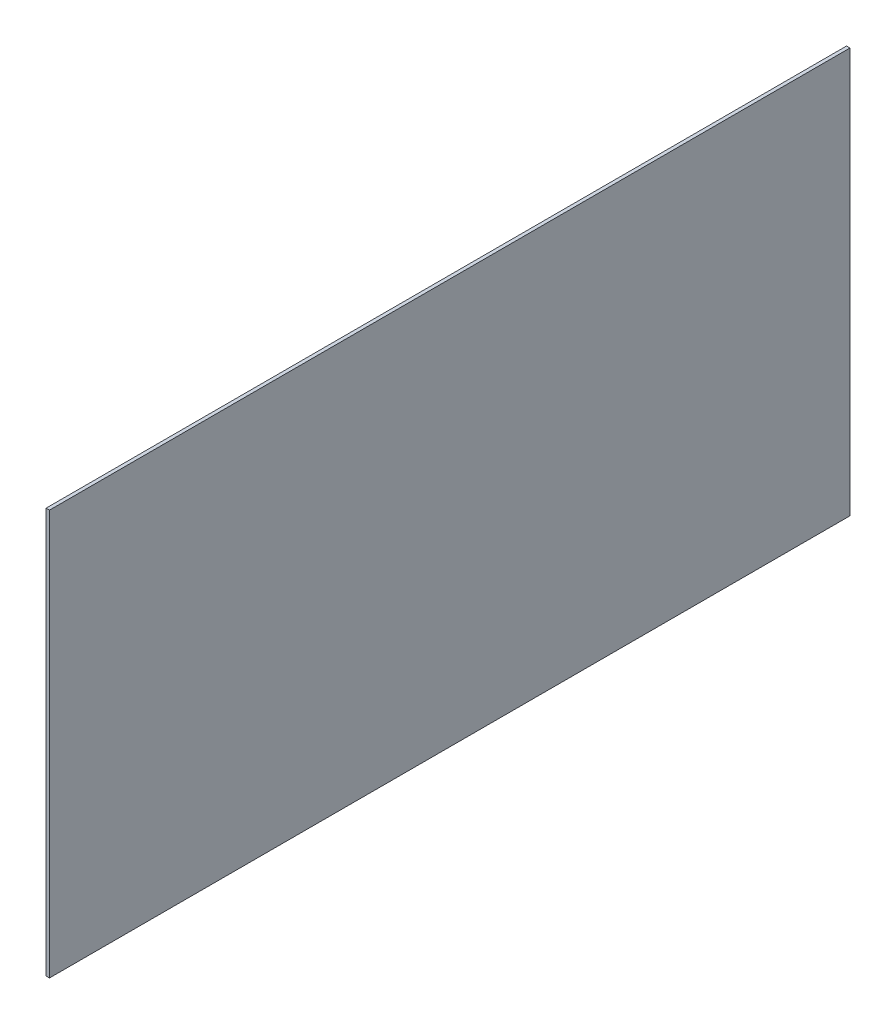
ISO-10303-21;
HEADER;
FILE_DESCRIPTION(('STEP AP214'),'2;1');
FILE_NAME('part.step','',(''),(''),'','','');
FILE_SCHEMA(('AUTOMOTIVE_DESIGN { 1 0 10303 214 1 1 1 1 }'));
ENDSEC;
DATA;
#1=APPLICATION_CONTEXT('core data for automotive mechanical design processes');
#2=APPLICATION_PROTOCOL_DEFINITION('international standard','automotive_design',2000,#1);
#3=PRODUCT_CONTEXT('',#1,'mechanical');
#4=PRODUCT('Part','Part','',(#3));
#5=PRODUCT_RELATED_PRODUCT_CATEGORY('part','',(#4));
#6=PRODUCT_DEFINITION_FORMATION('','',#4);
#7=PRODUCT_DEFINITION_CONTEXT('part definition',#1,'design');
#8=PRODUCT_DEFINITION('design','',#6,#7);
#9=PRODUCT_DEFINITION_SHAPE('','',#8);
#10=(LENGTH_UNIT() NAMED_UNIT(*) SI_UNIT(.MILLI.,.METRE.));
#11=(NAMED_UNIT(*) PLANE_ANGLE_UNIT() SI_UNIT($,.RADIAN.));
#12=(NAMED_UNIT(*) SI_UNIT($,.STERADIAN.) SOLID_ANGLE_UNIT());
#13=UNCERTAINTY_MEASURE_WITH_UNIT(LENGTH_MEASURE(1.E-05),#10,'distance_accuracy_value','');
#14=(GEOMETRIC_REPRESENTATION_CONTEXT(3) GLOBAL_UNCERTAINTY_ASSIGNED_CONTEXT((#13)) GLOBAL_UNIT_ASSIGNED_CONTEXT((#10,
#11,#12)) REPRESENTATION_CONTEXT('',''));
#15=CARTESIAN_POINT('',(0.,0.,0.));
#16=DIRECTION('',(0.,0.,1.));
#17=DIRECTION('',(1.,0.,0.));
#18=AXIS2_PLACEMENT_3D('',#15,#16,#17);
#19=CARTESIAN_POINT('',(1.5,-281.825999333606,472.174575352615));
#20=DIRECTION('',(0.,0.,-1.));
#21=DIRECTION('',(-1.,0.,0.));
#22=AXIS2_PLACEMENT_3D('',#19,#20,#21);
#23=PLANE('',#22);
#24=DIRECTION('',(0.,-1.,0.));
#25=VECTOR('',#24,1.);
#26=CARTESIAN_POINT('',(0.,-281.825999333606,472.174575352615));
#27=LINE('',#26,#25);
#28=CARTESIAN_POINT('',(0.,-104.425999333605,472.174575352615));
#29=VERTEX_POINT('',#28);
#30=CARTESIAN_POINT('',(0.,-281.825999333606,472.174575352615));
#31=VERTEX_POINT('',#30);
#32=EDGE_CURVE('E96',#29,#31,#27,.T.);
#33=ORIENTED_EDGE('',*,*,#32,.T.);
#34=DIRECTION('',(-1.,0.,0.));
#35=VECTOR('',#34,1.);
#36=CARTESIAN_POINT('',(1.5,-281.825999333606,472.174575352615));
#37=LINE('',#36,#35);
#38=CARTESIAN_POINT('',(1.5,-281.825999333606,472.174575352615));
#39=VERTEX_POINT('',#38);
#40=EDGE_CURVE('E11',#39,#31,#37,.T.);
#41=ORIENTED_EDGE('',*,*,#40,.F.);
#42=DIRECTION('',(0.,-1.,0.));
#43=VECTOR('',#42,1.);
#44=CARTESIAN_POINT('',(1.5,-281.825999333606,472.174575352615));
#45=LINE('',#44,#43);
#46=CARTESIAN_POINT('',(1.5,-104.425999333605,472.174575352615));
#47=VERTEX_POINT('',#46);
#48=EDGE_CURVE('E84',#47,#39,#45,.T.);
#49=ORIENTED_EDGE('',*,*,#48,.F.);
#50=DIRECTION('',(-1.,0.,0.));
#51=VECTOR('',#50,1.);
#52=CARTESIAN_POINT('',(1.5,-104.425999333605,472.174575352615));
#53=LINE('',#52,#51);
#54=EDGE_CURVE('E92',#47,#29,#53,.T.);
#55=ORIENTED_EDGE('',*,*,#54,.T.);
#56=EDGE_LOOP('',(#33,#41,#49,#55));
#57=FACE_BOUND('',#56,.T.);
#58=ADVANCED_FACE('F33',(#57),#23,.F.);
#59=CARTESIAN_POINT('',(1.5,-281.825999333604,121.698583064391));
#60=DIRECTION('',(0.,1.,0.));
#61=DIRECTION('',(0.,0.,1.));
#62=AXIS2_PLACEMENT_3D('',#59,#60,#61);
#63=PLANE('',#62);
#64=DIRECTION('',(0.,0.,-1.));
#65=VECTOR('',#64,1.);
#66=CARTESIAN_POINT('',(0.,-281.825999333604,121.698583064391));
#67=LINE('',#66,#65);
#68=CARTESIAN_POINT('',(0.,-281.825999333604,121.698583064391));
#69=VERTEX_POINT('',#68);
#70=EDGE_CURVE('E88',#31,#69,#67,.T.);
#71=ORIENTED_EDGE('',*,*,#70,.T.);
#72=DIRECTION('',(-1.,0.,0.));
#73=VECTOR('',#72,1.);
#74=CARTESIAN_POINT('',(1.5,-281.825999333604,121.698583064391));
#75=LINE('',#74,#73);
#76=CARTESIAN_POINT('',(1.5,-281.825999333604,121.698583064391));
#77=VERTEX_POINT('',#76);
#78=EDGE_CURVE('E41',#77,#69,#75,.T.);
#79=ORIENTED_EDGE('',*,*,#78,.F.);
#80=DIRECTION('',(0.,0.,-1.));
#81=VECTOR('',#80,1.);
#82=CARTESIAN_POINT('',(1.5,-281.825999333604,121.698583064391));
#83=LINE('',#82,#81);
#84=EDGE_CURVE('E79',#39,#77,#83,.T.);
#85=ORIENTED_EDGE('',*,*,#84,.F.);
#86=ORIENTED_EDGE('',*,*,#40,.T.);
#87=EDGE_LOOP('',(#71,#79,#85,#86));
#88=FACE_BOUND('',#87,.T.);
#89=ADVANCED_FACE('F87',(#88),#63,.F.);
#90=CARTESIAN_POINT('',(1.5,-281.825999333604,121.698583064391));
#91=DIRECTION('',(0.,0.,1.));
#92=DIRECTION('',(0.,-1.,0.));
#93=AXIS2_PLACEMENT_3D('',#90,#91,#92);
#94=PLANE('',#93);
#95=DIRECTION('',(0.,1.,0.));
#96=VECTOR('',#95,1.);
#97=CARTESIAN_POINT('',(0.,-281.825999333604,121.698583064391));
#98=LINE('',#97,#96);
#99=CARTESIAN_POINT('',(0.,-104.425999333605,121.698583064391));
#100=VERTEX_POINT('',#99);
#101=EDGE_CURVE('E66',#69,#100,#98,.T.);
#102=ORIENTED_EDGE('',*,*,#101,.T.);
#103=DIRECTION('',(-1.,0.,0.));
#104=VECTOR('',#103,1.);
#105=CARTESIAN_POINT('',(1.5,-104.425999333605,121.698583064391));
#106=LINE('',#105,#104);
#107=CARTESIAN_POINT('',(1.5,-104.425999333605,121.698583064391));
#108=VERTEX_POINT('',#107);
#109=EDGE_CURVE('E89',#108,#100,#106,.T.);
#110=ORIENTED_EDGE('',*,*,#109,.F.);
#111=DIRECTION('',(0.,1.,0.));
#112=VECTOR('',#111,1.);
#113=CARTESIAN_POINT('',(1.5,-281.825999333604,121.698583064391));
#114=LINE('',#113,#112);
#115=EDGE_CURVE('E82',#77,#108,#114,.T.);
#116=ORIENTED_EDGE('',*,*,#115,.F.);
#117=ORIENTED_EDGE('',*,*,#78,.T.);
#118=EDGE_LOOP('',(#102,#110,#116,#117));
#119=FACE_BOUND('',#118,.T.);
#120=ADVANCED_FACE('F90',(#119),#94,.F.);
#121=CARTESIAN_POINT('',(1.5,-104.425999333605,121.698583064391));
#122=DIRECTION('',(0.,-1.,0.));
#123=DIRECTION('',(0.,0.,-1.));
#124=AXIS2_PLACEMENT_3D('',#121,#122,#123);
#125=PLANE('',#124);
#126=DIRECTION('',(0.,0.,1.));
#127=VECTOR('',#126,1.);
#128=CARTESIAN_POINT('',(0.,-104.425999333605,121.698583064391));
#129=LINE('',#128,#127);
#130=EDGE_CURVE('E72',#100,#29,#129,.T.);
#131=ORIENTED_EDGE('',*,*,#130,.T.);
#132=ORIENTED_EDGE('',*,*,#54,.F.);
#133=DIRECTION('',(0.,0.,1.));
#134=VECTOR('',#133,1.);
#135=CARTESIAN_POINT('',(1.5,-104.425999333605,121.698583064391));
#136=LINE('',#135,#134);
#137=EDGE_CURVE('E49',#108,#47,#136,.T.);
#138=ORIENTED_EDGE('',*,*,#137,.F.);
#139=ORIENTED_EDGE('',*,*,#109,.T.);
#140=EDGE_LOOP('',(#131,#132,#138,#139));
#141=FACE_BOUND('',#140,.T.);
#142=ADVANCED_FACE('F103',(#141),#125,.F.);
#143=CARTESIAN_POINT('',(1.5,0.,0.));
#144=DIRECTION('',(1.,0.,0.));
#145=DIRECTION('',(0.,0.,-1.));
#146=AXIS2_PLACEMENT_3D('',#143,#144,#145);
#147=PLANE('',#146);
#148=ORIENTED_EDGE('',*,*,#48,.T.);
#149=ORIENTED_EDGE('',*,*,#84,.T.);
#150=ORIENTED_EDGE('',*,*,#115,.T.);
#151=ORIENTED_EDGE('',*,*,#137,.T.);
#152=EDGE_LOOP('',(#148,#149,#150,#151));
#153=FACE_BOUND('',#152,.T.);
#154=ADVANCED_FACE('F80',(#153),#147,.T.);
#155=CARTESIAN_POINT('',(0.,0.,0.));
#156=DIRECTION('',(1.,0.,0.));
#157=DIRECTION('',(0.,0.,-1.));
#158=AXIS2_PLACEMENT_3D('',#155,#156,#157);
#159=PLANE('',#158);
#160=ORIENTED_EDGE('',*,*,#32,.F.);
#161=ORIENTED_EDGE('',*,*,#130,.F.);
#162=ORIENTED_EDGE('',*,*,#101,.F.);
#163=ORIENTED_EDGE('',*,*,#70,.F.);
#164=EDGE_LOOP('',(#160,#161,#162,#163));
#165=FACE_BOUND('',#164,.T.);
#166=ADVANCED_FACE('F106',(#165),#159,.F.);
#167=CLOSED_SHELL('',(#58,#89,#120,#142,#154,#166));
#168=MANIFOLD_SOLID_BREP('B2',#167);
#169=ADVANCED_BREP_SHAPE_REPRESENTATION('',(#18,#168),#14);
#170=SHAPE_DEFINITION_REPRESENTATION(#9,#169);
ENDSEC;
END-ISO-10303-21;
